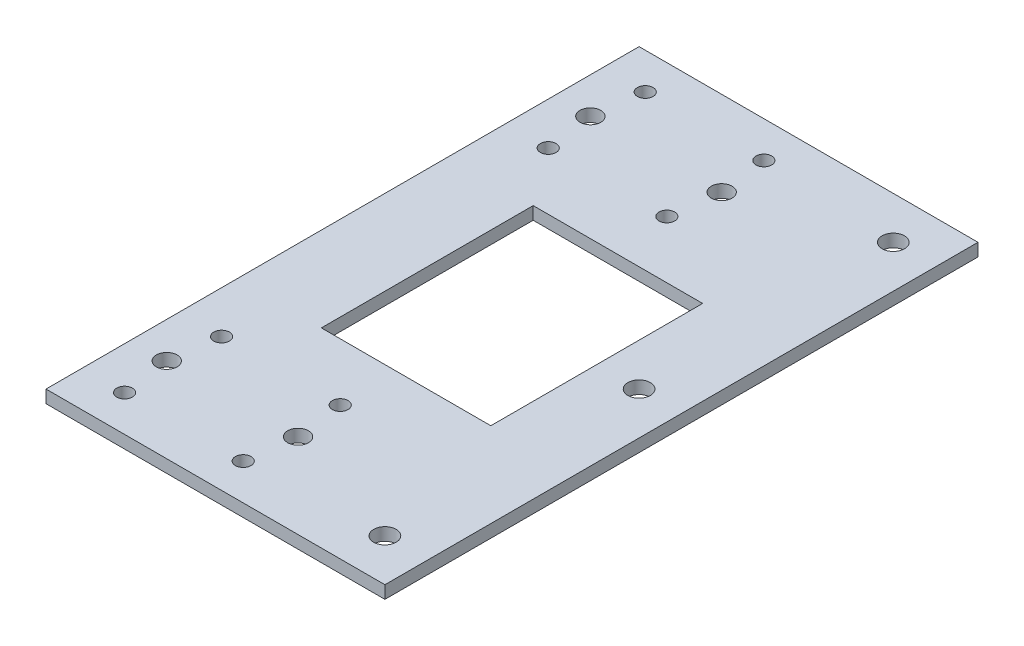
ISO-10303-21;
HEADER;
FILE_DESCRIPTION(('STEP AP214'),'2;1');
FILE_NAME('part.step','',(''),(''),'','','');
FILE_SCHEMA(('AUTOMOTIVE_DESIGN { 1 0 10303 214 1 1 1 1 }'));
ENDSEC;
DATA;
#1=APPLICATION_CONTEXT('core data for automotive mechanical design processes');
#2=APPLICATION_PROTOCOL_DEFINITION('international standard','automotive_design',2000,#1);
#3=PRODUCT_CONTEXT('',#1,'mechanical');
#4=PRODUCT('Part','Part','',(#3));
#5=PRODUCT_RELATED_PRODUCT_CATEGORY('part','',(#4));
#6=PRODUCT_DEFINITION_FORMATION('','',#4);
#7=PRODUCT_DEFINITION_CONTEXT('part definition',#1,'design');
#8=PRODUCT_DEFINITION('design','',#6,#7);
#9=PRODUCT_DEFINITION_SHAPE('','',#8);
#10=(LENGTH_UNIT() NAMED_UNIT(*) SI_UNIT(.MILLI.,.METRE.));
#11=(NAMED_UNIT(*) PLANE_ANGLE_UNIT() SI_UNIT($,.RADIAN.));
#12=(NAMED_UNIT(*) SI_UNIT($,.STERADIAN.) SOLID_ANGLE_UNIT());
#13=UNCERTAINTY_MEASURE_WITH_UNIT(LENGTH_MEASURE(1.E-05),#10,'distance_accuracy_value','');
#14=(GEOMETRIC_REPRESENTATION_CONTEXT(3) GLOBAL_UNCERTAINTY_ASSIGNED_CONTEXT((#13)) GLOBAL_UNIT_ASSIGNED_CONTEXT((#10,
#11,#12)) REPRESENTATION_CONTEXT('',''));
#15=CARTESIAN_POINT('',(0.,0.,0.));
#16=DIRECTION('',(0.,0.,1.));
#17=DIRECTION('',(1.,0.,0.));
#18=AXIS2_PLACEMENT_3D('',#15,#16,#17);
#19=CARTESIAN_POINT('',(40.,3.,0.));
#20=DIRECTION('',(-1.,0.,0.));
#21=DIRECTION('',(0.,0.,1.));
#22=AXIS2_PLACEMENT_3D('',#19,#20,#21);
#23=PLANE('',#22);
#24=DIRECTION('',(0.,0.,-1.));
#25=VECTOR('',#24,1.);
#26=CARTESIAN_POINT('',(40.,0.,0.));
#27=LINE('',#26,#25);
#28=CARTESIAN_POINT('',(40.,0.,70.));
#29=VERTEX_POINT('',#28);
#30=CARTESIAN_POINT('',(40.,0.,-70.));
#31=VERTEX_POINT('',#30);
#32=EDGE_CURVE('E228',#29,#31,#27,.T.);
#33=ORIENTED_EDGE('',*,*,#32,.T.);
#34=DIRECTION('',(0.,-1.,0.));
#35=VECTOR('',#34,1.);
#36=CARTESIAN_POINT('',(40.,3.,-70.));
#37=LINE('',#36,#35);
#38=CARTESIAN_POINT('',(40.,3.,-70.));
#39=VERTEX_POINT('',#38);
#40=EDGE_CURVE('E11',#39,#31,#37,.T.);
#41=ORIENTED_EDGE('',*,*,#40,.F.);
#42=DIRECTION('',(0.,0.,-1.));
#43=VECTOR('',#42,1.);
#44=CARTESIAN_POINT('',(40.,3.,0.));
#45=LINE('',#44,#43);
#46=CARTESIAN_POINT('',(40.,3.,70.));
#47=VERTEX_POINT('',#46);
#48=EDGE_CURVE('E165',#47,#39,#45,.T.);
#49=ORIENTED_EDGE('',*,*,#48,.F.);
#50=DIRECTION('',(0.,-1.,0.));
#51=VECTOR('',#50,1.);
#52=CARTESIAN_POINT('',(40.,3.,70.));
#53=LINE('',#52,#51);
#54=EDGE_CURVE('E224',#47,#29,#53,.T.);
#55=ORIENTED_EDGE('',*,*,#54,.T.);
#56=EDGE_LOOP('',(#33,#41,#49,#55));
#57=FACE_BOUND('',#56,.T.);
#58=ADVANCED_FACE('F46',(#57),#23,.F.);
#59=CARTESIAN_POINT('',(0.,3.,-70.));
#60=DIRECTION('',(0.,0.,-1.));
#61=DIRECTION('',(-1.,0.,0.));
#62=AXIS2_PLACEMENT_3D('',#59,#60,#61);
#63=PLANE('',#62);
#64=DIRECTION('',(1.,0.,0.));
#65=VECTOR('',#64,1.);
#66=CARTESIAN_POINT('',(0.,0.,-70.));
#67=LINE('',#66,#65);
#68=CARTESIAN_POINT('',(-40.,0.,-70.));
#69=VERTEX_POINT('',#68);
#70=EDGE_CURVE('E232',#69,#31,#67,.T.);
#71=ORIENTED_EDGE('',*,*,#70,.F.);
#72=DIRECTION('',(0.,-1.,0.));
#73=VECTOR('',#72,1.);
#74=CARTESIAN_POINT('',(-40.,3.,-70.));
#75=LINE('',#74,#73);
#76=CARTESIAN_POINT('',(-40.,3.,-70.));
#77=VERTEX_POINT('',#76);
#78=EDGE_CURVE('E56',#77,#69,#75,.T.);
#79=ORIENTED_EDGE('',*,*,#78,.F.);
#80=DIRECTION('',(1.,0.,0.));
#81=VECTOR('',#80,1.);
#82=CARTESIAN_POINT('',(0.,3.,-70.));
#83=LINE('',#82,#81);
#84=EDGE_CURVE('E169',#77,#39,#83,.T.);
#85=ORIENTED_EDGE('',*,*,#84,.T.);
#86=ORIENTED_EDGE('',*,*,#40,.T.);
#87=EDGE_LOOP('',(#71,#79,#85,#86));
#88=FACE_BOUND('',#87,.T.);
#89=ADVANCED_FACE('F377',(#88),#63,.T.);
#90=CARTESIAN_POINT('',(-40.,3.,0.));
#91=DIRECTION('',(-1.,0.,0.));
#92=DIRECTION('',(0.,0.,1.));
#93=AXIS2_PLACEMENT_3D('',#90,#91,#92);
#94=PLANE('',#93);
#95=DIRECTION('',(0.,0.,-1.));
#96=VECTOR('',#95,1.);
#97=CARTESIAN_POINT('',(-40.,0.,0.));
#98=LINE('',#97,#96);
#99=CARTESIAN_POINT('',(-40.,0.,70.));
#100=VERTEX_POINT('',#99);
#101=EDGE_CURVE('E236',#100,#69,#98,.T.);
#102=ORIENTED_EDGE('',*,*,#101,.F.);
#103=DIRECTION('',(0.,-1.,0.));
#104=VECTOR('',#103,1.);
#105=CARTESIAN_POINT('',(-40.,3.,70.));
#106=LINE('',#105,#104);
#107=CARTESIAN_POINT('',(-40.,3.,70.));
#108=VERTEX_POINT('',#107);
#109=EDGE_CURVE('E289',#108,#100,#106,.T.);
#110=ORIENTED_EDGE('',*,*,#109,.F.);
#111=DIRECTION('',(0.,0.,-1.));
#112=VECTOR('',#111,1.);
#113=CARTESIAN_POINT('',(-40.,3.,0.));
#114=LINE('',#113,#112);
#115=EDGE_CURVE('E173',#108,#77,#114,.T.);
#116=ORIENTED_EDGE('',*,*,#115,.T.);
#117=ORIENTED_EDGE('',*,*,#78,.T.);
#118=EDGE_LOOP('',(#102,#110,#116,#117));
#119=FACE_BOUND('',#118,.T.);
#120=ADVANCED_FACE('F382',(#119),#94,.T.);
#121=CARTESIAN_POINT('',(-0.499999999999992,3.,-50.));
#122=DIRECTION('',(0.,-1.,0.));
#123=DIRECTION('',(0.,0.,-1.));
#124=AXIS2_PLACEMENT_3D('',#121,#122,#123);
#125=CYLINDRICAL_SURFACE('',#124,2.45);
#126=CARTESIAN_POINT('',(-0.499999999999992,3.,-50.));
#127=DIRECTION('',(0.,1.,0.));
#128=DIRECTION('',(0.,0.,1.));
#129=AXIS2_PLACEMENT_3D('',#126,#127,#128);
#130=CIRCLE('',#129,2.45);
#131=CARTESIAN_POINT('',(-0.499999999999992,3.,-47.55));
#132=VERTEX_POINT('',#131);
#133=EDGE_CURVE('E216',#132,#132,#130,.T.);
#134=ORIENTED_EDGE('',*,*,#133,.T.);
#135=EDGE_LOOP('',(#134));
#136=FACE_BOUND('',#135,.T.);
#137=CARTESIAN_POINT('',(-0.499999999999992,0.,-50.));
#138=DIRECTION('',(0.,1.,0.));
#139=DIRECTION('',(0.,0.,1.));
#140=AXIS2_PLACEMENT_3D('',#137,#138,#139);
#141=CIRCLE('',#140,2.45);
#142=CARTESIAN_POINT('',(-0.499999999999992,0.,-47.55));
#143=VERTEX_POINT('',#142);
#144=EDGE_CURVE('E279',#143,#143,#141,.T.);
#145=ORIENTED_EDGE('',*,*,#144,.F.);
#146=EDGE_LOOP('',(#145));
#147=FACE_BOUND('',#146,.T.);
#148=ADVANCED_FACE('F388',(#136,#147),#125,.F.);
#149=CARTESIAN_POINT('',(-2.00000000000001,3.,-61.45));
#150=DIRECTION('',(0.,-1.,0.));
#151=DIRECTION('',(0.,0.,-1.));
#152=AXIS2_PLACEMENT_3D('',#149,#150,#151);
#153=CYLINDRICAL_SURFACE('',#152,1.85);
#154=CARTESIAN_POINT('',(-2.00000000000001,3.,-61.45));
#155=DIRECTION('',(0.,1.,0.));
#156=DIRECTION('',(0.,0.,1.));
#157=AXIS2_PLACEMENT_3D('',#154,#155,#156);
#158=CIRCLE('',#157,1.85);
#159=CARTESIAN_POINT('',(-2.00000000000001,3.,-59.6));
#160=VERTEX_POINT('',#159);
#161=EDGE_CURVE('E212',#160,#160,#158,.F.);
#162=ORIENTED_EDGE('',*,*,#161,.F.);
#163=EDGE_LOOP('',(#162));
#164=FACE_BOUND('',#163,.T.);
#165=CARTESIAN_POINT('',(-2.00000000000001,0.,-61.45));
#166=DIRECTION('',(0.,1.,0.));
#167=DIRECTION('',(0.,0.,1.));
#168=AXIS2_PLACEMENT_3D('',#165,#166,#167);
#169=CIRCLE('',#168,1.85);
#170=CARTESIAN_POINT('',(-2.00000000000001,0.,-59.6));
#171=VERTEX_POINT('',#170);
#172=EDGE_CURVE('E275',#171,#171,#169,.F.);
#173=ORIENTED_EDGE('',*,*,#172,.T.);
#174=EDGE_LOOP('',(#173));
#175=FACE_BOUND('',#174,.T.);
#176=ADVANCED_FACE('F425',(#164,#175),#153,.F.);
#177=CARTESIAN_POINT('',(-2.00000000000001,3.,-38.55));
#178=DIRECTION('',(0.,-1.,0.));
#179=DIRECTION('',(0.,0.,-1.));
#180=AXIS2_PLACEMENT_3D('',#177,#178,#179);
#181=CYLINDRICAL_SURFACE('',#180,1.85);
#182=CARTESIAN_POINT('',(-2.00000000000001,3.,-38.55));
#183=DIRECTION('',(0.,1.,0.));
#184=DIRECTION('',(0.,0.,1.));
#185=AXIS2_PLACEMENT_3D('',#182,#183,#184);
#186=CIRCLE('',#185,1.85);
#187=CARTESIAN_POINT('',(-2.00000000000001,3.,-36.7));
#188=VERTEX_POINT('',#187);
#189=EDGE_CURVE('E208',#188,#188,#186,.T.);
#190=ORIENTED_EDGE('',*,*,#189,.T.);
#191=EDGE_LOOP('',(#190));
#192=FACE_BOUND('',#191,.T.);
#193=CARTESIAN_POINT('',(-2.00000000000001,0.,-38.55));
#194=DIRECTION('',(0.,1.,0.));
#195=DIRECTION('',(0.,0.,1.));
#196=AXIS2_PLACEMENT_3D('',#193,#194,#195);
#197=CIRCLE('',#196,1.85);
#198=CARTESIAN_POINT('',(-2.00000000000001,0.,-36.7));
#199=VERTEX_POINT('',#198);
#200=EDGE_CURVE('E271',#199,#199,#197,.T.);
#201=ORIENTED_EDGE('',*,*,#200,.F.);
#202=EDGE_LOOP('',(#201));
#203=FACE_BOUND('',#202,.T.);
#204=ADVANCED_FACE('F421',(#192,#203),#181,.F.);
#205=CARTESIAN_POINT('',(-30.,3.,-38.55));
#206=DIRECTION('',(0.,-1.,0.));
#207=DIRECTION('',(0.,0.,-1.));
#208=AXIS2_PLACEMENT_3D('',#205,#206,#207);
#209=CYLINDRICAL_SURFACE('',#208,1.85);
#210=CARTESIAN_POINT('',(-30.,3.,-38.55));
#211=DIRECTION('',(0.,1.,0.));
#212=DIRECTION('',(0.,0.,1.));
#213=AXIS2_PLACEMENT_3D('',#210,#211,#212);
#214=CIRCLE('',#213,1.85);
#215=CARTESIAN_POINT('',(-30.,3.,-36.7));
#216=VERTEX_POINT('',#215);
#217=EDGE_CURVE('E204',#216,#216,#214,.F.);
#218=ORIENTED_EDGE('',*,*,#217,.F.);
#219=EDGE_LOOP('',(#218));
#220=FACE_BOUND('',#219,.T.);
#221=CARTESIAN_POINT('',(-30.,0.,-38.55));
#222=DIRECTION('',(0.,1.,0.));
#223=DIRECTION('',(0.,0.,1.));
#224=AXIS2_PLACEMENT_3D('',#221,#222,#223);
#225=CIRCLE('',#224,1.85);
#226=CARTESIAN_POINT('',(-30.,0.,-36.7));
#227=VERTEX_POINT('',#226);
#228=EDGE_CURVE('E267',#227,#227,#225,.F.);
#229=ORIENTED_EDGE('',*,*,#228,.T.);
#230=EDGE_LOOP('',(#229));
#231=FACE_BOUND('',#230,.T.);
#232=ADVANCED_FACE('F417',(#220,#231),#209,.F.);
#233=CARTESIAN_POINT('',(-30.,3.,61.4500000000001));
#234=DIRECTION('',(0.,-1.,0.));
#235=DIRECTION('',(0.,0.,-1.));
#236=AXIS2_PLACEMENT_3D('',#233,#234,#235);
#237=CYLINDRICAL_SURFACE('',#236,1.85);
#238=CARTESIAN_POINT('',(-30.,3.,61.4500000000001));
#239=DIRECTION('',(0.,1.,0.));
#240=DIRECTION('',(0.,0.,1.));
#241=AXIS2_PLACEMENT_3D('',#238,#239,#240);
#242=CIRCLE('',#241,1.85);
#243=CARTESIAN_POINT('',(-30.,3.,63.3000000000001));
#244=VERTEX_POINT('',#243);
#245=EDGE_CURVE('E200',#244,#244,#242,.F.);
#246=ORIENTED_EDGE('',*,*,#245,.F.);
#247=EDGE_LOOP('',(#246));
#248=FACE_BOUND('',#247,.T.);
#249=CARTESIAN_POINT('',(-30.,0.,61.4500000000001));
#250=DIRECTION('',(0.,1.,0.));
#251=DIRECTION('',(0.,0.,1.));
#252=AXIS2_PLACEMENT_3D('',#249,#250,#251);
#253=CIRCLE('',#252,1.85);
#254=CARTESIAN_POINT('',(-30.,0.,63.3000000000001));
#255=VERTEX_POINT('',#254);
#256=EDGE_CURVE('E263',#255,#255,#253,.F.);
#257=ORIENTED_EDGE('',*,*,#256,.T.);
#258=EDGE_LOOP('',(#257));
#259=FACE_BOUND('',#258,.T.);
#260=ADVANCED_FACE('F413',(#248,#259),#237,.F.);
#261=CARTESIAN_POINT('',(-31.5,3.,50.));
#262=DIRECTION('',(0.,-1.,0.));
#263=DIRECTION('',(0.,0.,-1.));
#264=AXIS2_PLACEMENT_3D('',#261,#262,#263);
#265=CYLINDRICAL_SURFACE('',#264,2.45);
#266=CARTESIAN_POINT('',(-31.5,3.,50.));
#267=DIRECTION('',(0.,1.,0.));
#268=DIRECTION('',(0.,0.,1.));
#269=AXIS2_PLACEMENT_3D('',#266,#267,#268);
#270=CIRCLE('',#269,2.45);
#271=CARTESIAN_POINT('',(-31.5,3.,52.4500000000001));
#272=VERTEX_POINT('',#271);
#273=EDGE_CURVE('E196',#272,#272,#270,.T.);
#274=ORIENTED_EDGE('',*,*,#273,.T.);
#275=EDGE_LOOP('',(#274));
#276=FACE_BOUND('',#275,.T.);
#277=CARTESIAN_POINT('',(-31.5,0.,50.));
#278=DIRECTION('',(0.,1.,0.));
#279=DIRECTION('',(0.,0.,1.));
#280=AXIS2_PLACEMENT_3D('',#277,#278,#279);
#281=CIRCLE('',#280,2.45);
#282=CARTESIAN_POINT('',(-31.5,0.,52.4500000000001));
#283=VERTEX_POINT('',#282);
#284=EDGE_CURVE('E259',#283,#283,#281,.T.);
#285=ORIENTED_EDGE('',*,*,#284,.F.);
#286=EDGE_LOOP('',(#285));
#287=FACE_BOUND('',#286,.T.);
#288=ADVANCED_FACE('F409',(#276,#287),#265,.F.);
#289=CARTESIAN_POINT('',(-30.,3.,38.55));
#290=DIRECTION('',(0.,-1.,0.));
#291=DIRECTION('',(0.,0.,-1.));
#292=AXIS2_PLACEMENT_3D('',#289,#290,#291);
#293=CYLINDRICAL_SURFACE('',#292,1.85);
#294=CARTESIAN_POINT('',(-30.,3.,38.55));
#295=DIRECTION('',(0.,1.,0.));
#296=DIRECTION('',(0.,0.,1.));
#297=AXIS2_PLACEMENT_3D('',#294,#295,#296);
#298=CIRCLE('',#297,1.85);
#299=CARTESIAN_POINT('',(-30.,3.,40.4));
#300=VERTEX_POINT('',#299);
#301=EDGE_CURVE('E192',#300,#300,#298,.T.);
#302=ORIENTED_EDGE('',*,*,#301,.T.);
#303=EDGE_LOOP('',(#302));
#304=FACE_BOUND('',#303,.T.);
#305=CARTESIAN_POINT('',(-30.,0.,38.55));
#306=DIRECTION('',(0.,1.,0.));
#307=DIRECTION('',(0.,0.,1.));
#308=AXIS2_PLACEMENT_3D('',#305,#306,#307);
#309=CIRCLE('',#308,1.85);
#310=CARTESIAN_POINT('',(-30.,0.,40.4));
#311=VERTEX_POINT('',#310);
#312=EDGE_CURVE('E255',#311,#311,#309,.T.);
#313=ORIENTED_EDGE('',*,*,#312,.F.);
#314=EDGE_LOOP('',(#313));
#315=FACE_BOUND('',#314,.T.);
#316=ADVANCED_FACE('F405',(#304,#315),#293,.F.);
#317=CARTESIAN_POINT('',(-2.00000000000001,3.,61.4500000000001));
#318=DIRECTION('',(0.,-1.,0.));
#319=DIRECTION('',(0.,0.,-1.));
#320=AXIS2_PLACEMENT_3D('',#317,#318,#319);
#321=CYLINDRICAL_SURFACE('',#320,1.85);
#322=CARTESIAN_POINT('',(-2.00000000000001,3.,61.4500000000001));
#323=DIRECTION('',(0.,1.,0.));
#324=DIRECTION('',(0.,0.,1.));
#325=AXIS2_PLACEMENT_3D('',#322,#323,#324);
#326=CIRCLE('',#325,1.85);
#327=CARTESIAN_POINT('',(-2.00000000000001,3.,63.3000000000001));
#328=VERTEX_POINT('',#327);
#329=EDGE_CURVE('E188',#328,#328,#326,.T.);
#330=ORIENTED_EDGE('',*,*,#329,.T.);
#331=EDGE_LOOP('',(#330));
#332=FACE_BOUND('',#331,.T.);
#333=CARTESIAN_POINT('',(-2.00000000000001,0.,61.4500000000001));
#334=DIRECTION('',(0.,1.,0.));
#335=DIRECTION('',(0.,0.,1.));
#336=AXIS2_PLACEMENT_3D('',#333,#334,#335);
#337=CIRCLE('',#336,1.85);
#338=CARTESIAN_POINT('',(-2.00000000000001,0.,63.3000000000001));
#339=VERTEX_POINT('',#338);
#340=EDGE_CURVE('E251',#339,#339,#337,.T.);
#341=ORIENTED_EDGE('',*,*,#340,.F.);
#342=EDGE_LOOP('',(#341));
#343=FACE_BOUND('',#342,.T.);
#344=ADVANCED_FACE('F401',(#332,#343),#321,.F.);
#345=CARTESIAN_POINT('',(-2.00000000000001,3.,38.55));
#346=DIRECTION('',(0.,-1.,0.));
#347=DIRECTION('',(0.,0.,-1.));
#348=AXIS2_PLACEMENT_3D('',#345,#346,#347);
#349=CYLINDRICAL_SURFACE('',#348,1.85);
#350=CARTESIAN_POINT('',(-2.00000000000001,3.,38.55));
#351=DIRECTION('',(0.,1.,0.));
#352=DIRECTION('',(0.,0.,1.));
#353=AXIS2_PLACEMENT_3D('',#350,#351,#352);
#354=CIRCLE('',#353,1.85);
#355=CARTESIAN_POINT('',(-2.00000000000001,3.,40.4));
#356=VERTEX_POINT('',#355);
#357=EDGE_CURVE('E184',#356,#356,#354,.F.);
#358=ORIENTED_EDGE('',*,*,#357,.F.);
#359=EDGE_LOOP('',(#358));
#360=FACE_BOUND('',#359,.T.);
#361=CARTESIAN_POINT('',(-2.00000000000001,0.,38.55));
#362=DIRECTION('',(0.,1.,0.));
#363=DIRECTION('',(0.,0.,1.));
#364=AXIS2_PLACEMENT_3D('',#361,#362,#363);
#365=CIRCLE('',#364,1.85);
#366=CARTESIAN_POINT('',(-2.00000000000001,0.,40.4));
#367=VERTEX_POINT('',#366);
#368=EDGE_CURVE('E247',#367,#367,#365,.F.);
#369=ORIENTED_EDGE('',*,*,#368,.T.);
#370=EDGE_LOOP('',(#369));
#371=FACE_BOUND('',#370,.T.);
#372=ADVANCED_FACE('F397',(#360,#371),#349,.F.);
#373=CARTESIAN_POINT('',(-0.499999999999992,3.,50.));
#374=DIRECTION('',(0.,-1.,0.));
#375=DIRECTION('',(0.,0.,-1.));
#376=AXIS2_PLACEMENT_3D('',#373,#374,#375);
#377=CYLINDRICAL_SURFACE('',#376,2.45);
#378=CARTESIAN_POINT('',(-0.499999999999992,3.,50.));
#379=DIRECTION('',(0.,1.,0.));
#380=DIRECTION('',(0.,0.,1.));
#381=AXIS2_PLACEMENT_3D('',#378,#379,#380);
#382=CIRCLE('',#381,2.45);
#383=CARTESIAN_POINT('',(-0.499999999999992,3.,52.4500000000001));
#384=VERTEX_POINT('',#383);
#385=EDGE_CURVE('E180',#384,#384,#382,.F.);
#386=ORIENTED_EDGE('',*,*,#385,.F.);
#387=EDGE_LOOP('',(#386));
#388=FACE_BOUND('',#387,.T.);
#389=CARTESIAN_POINT('',(-0.499999999999992,0.,50.));
#390=DIRECTION('',(0.,1.,0.));
#391=DIRECTION('',(0.,0.,1.));
#392=AXIS2_PLACEMENT_3D('',#389,#390,#391);
#393=CIRCLE('',#392,2.45);
#394=CARTESIAN_POINT('',(-0.499999999999992,0.,52.4500000000001));
#395=VERTEX_POINT('',#394);
#396=EDGE_CURVE('E243',#395,#395,#393,.F.);
#397=ORIENTED_EDGE('',*,*,#396,.T.);
#398=EDGE_LOOP('',(#397));
#399=FACE_BOUND('',#398,.T.);
#400=ADVANCED_FACE('F393',(#388,#399),#377,.F.);
#401=CARTESIAN_POINT('',(0.,3.,70.));
#402=DIRECTION('',(0.,0.,-1.));
#403=DIRECTION('',(-1.,0.,0.));
#404=AXIS2_PLACEMENT_3D('',#401,#402,#403);
#405=PLANE('',#404);
#406=DIRECTION('',(1.,0.,0.));
#407=VECTOR('',#406,1.);
#408=CARTESIAN_POINT('',(0.,0.,70.));
#409=LINE('',#408,#407);
#410=EDGE_CURVE('E240',#100,#29,#409,.T.);
#411=ORIENTED_EDGE('',*,*,#410,.T.);
#412=ORIENTED_EDGE('',*,*,#54,.F.);
#413=DIRECTION('',(1.,0.,0.));
#414=VECTOR('',#413,1.);
#415=CARTESIAN_POINT('',(0.,3.,70.));
#416=LINE('',#415,#414);
#417=EDGE_CURVE('E177',#108,#47,#416,.T.);
#418=ORIENTED_EDGE('',*,*,#417,.F.);
#419=ORIENTED_EDGE('',*,*,#109,.T.);
#420=EDGE_LOOP('',(#411,#412,#418,#419));
#421=FACE_BOUND('',#420,.T.);
#422=ADVANCED_FACE('F390',(#421),#405,.F.);
#423=CARTESIAN_POINT('',(-30.,3.,-61.45));
#424=DIRECTION('',(0.,-1.,0.));
#425=DIRECTION('',(0.,0.,-1.));
#426=AXIS2_PLACEMENT_3D('',#423,#424,#425);
#427=CYLINDRICAL_SURFACE('',#426,1.85);
#428=CARTESIAN_POINT('',(-30.,3.,-61.45));
#429=DIRECTION('',(0.,1.,0.));
#430=DIRECTION('',(0.,0.,1.));
#431=AXIS2_PLACEMENT_3D('',#428,#429,#430);
#432=CIRCLE('',#431,1.85);
#433=CARTESIAN_POINT('',(-30.,3.,-59.6));
#434=VERTEX_POINT('',#433);
#435=EDGE_CURVE('E161',#434,#434,#432,.T.);
#436=ORIENTED_EDGE('',*,*,#435,.T.);
#437=EDGE_LOOP('',(#436));
#438=FACE_BOUND('',#437,.T.);
#439=CARTESIAN_POINT('',(-30.,0.,-61.45));
#440=DIRECTION('',(0.,1.,0.));
#441=DIRECTION('',(0.,0.,1.));
#442=AXIS2_PLACEMENT_3D('',#439,#440,#441);
#443=CIRCLE('',#442,1.85);
#444=CARTESIAN_POINT('',(-30.,0.,-59.6));
#445=VERTEX_POINT('',#444);
#446=EDGE_CURVE('E129',#445,#445,#443,.T.);
#447=ORIENTED_EDGE('',*,*,#446,.F.);
#448=EDGE_LOOP('',(#447));
#449=FACE_BOUND('',#448,.T.);
#450=ADVANCED_FACE('F48',(#438,#449),#427,.F.);
#451=CARTESIAN_POINT('',(-31.5,3.,-50.));
#452=DIRECTION('',(0.,-1.,0.));
#453=DIRECTION('',(0.,0.,-1.));
#454=AXIS2_PLACEMENT_3D('',#451,#452,#453);
#455=CYLINDRICAL_SURFACE('',#454,2.45);
#456=CARTESIAN_POINT('',(-31.5,3.,-50.));
#457=DIRECTION('',(0.,1.,0.));
#458=DIRECTION('',(0.,0.,1.));
#459=AXIS2_PLACEMENT_3D('',#456,#457,#458);
#460=CIRCLE('',#459,2.45);
#461=CARTESIAN_POINT('',(-31.5,3.,-47.55));
#462=VERTEX_POINT('',#461);
#463=EDGE_CURVE('E220',#462,#462,#460,.F.);
#464=ORIENTED_EDGE('',*,*,#463,.F.);
#465=EDGE_LOOP('',(#464));
#466=FACE_BOUND('',#465,.T.);
#467=CARTESIAN_POINT('',(-31.5,0.,-50.));
#468=DIRECTION('',(0.,1.,0.));
#469=DIRECTION('',(0.,0.,1.));
#470=AXIS2_PLACEMENT_3D('',#467,#468,#469);
#471=CIRCLE('',#470,2.45);
#472=CARTESIAN_POINT('',(-31.5,0.,-47.55));
#473=VERTEX_POINT('',#472);
#474=EDGE_CURVE('E166',#473,#473,#471,.F.);
#475=ORIENTED_EDGE('',*,*,#474,.T.);
#476=EDGE_LOOP('',(#475));
#477=FACE_BOUND('',#476,.T.);
#478=ADVANCED_FACE('F327',(#466,#477),#455,.F.);
#479=CARTESIAN_POINT('',(0.,3.,0.));
#480=DIRECTION('',(0.,1.,0.));
#481=DIRECTION('',(0.,0.,1.));
#482=AXIS2_PLACEMENT_3D('',#479,#480,#481);
#483=PLANE('',#482);
#484=CARTESIAN_POINT('',(30.,3.,-60.));
#485=DIRECTION('',(0.,1.,0.));
#486=DIRECTION('',(0.,0.,1.));
#487=AXIS2_PLACEMENT_3D('',#484,#485,#486);
#488=CIRCLE('',#487,2.65);
#489=CARTESIAN_POINT('',(30.,3.,-57.35));
#490=VERTEX_POINT('',#489);
#491=EDGE_CURVE('E298',#490,#490,#488,.T.);
#492=ORIENTED_EDGE('',*,*,#491,.F.);
#493=EDGE_LOOP('',(#492));
#494=FACE_BOUND('',#493,.T.);
#495=CARTESIAN_POINT('',(30.0000000000006,3.,0.));
#496=DIRECTION('',(0.,1.,0.));
#497=DIRECTION('',(0.,0.,1.));
#498=AXIS2_PLACEMENT_3D('',#495,#496,#497);
#499=CIRCLE('',#498,2.65);
#500=CARTESIAN_POINT('',(30.0000000000006,3.,2.64999999999999));
#501=VERTEX_POINT('',#500);
#502=EDGE_CURVE('E313',#501,#501,#499,.T.);
#503=ORIENTED_EDGE('',*,*,#502,.F.);
#504=EDGE_LOOP('',(#503));
#505=FACE_BOUND('',#504,.T.);
#506=CARTESIAN_POINT('',(30.0000000000012,3.,60.));
#507=DIRECTION('',(0.,1.,0.));
#508=DIRECTION('',(0.,0.,1.));
#509=AXIS2_PLACEMENT_3D('',#506,#507,#508);
#510=CIRCLE('',#509,2.65);
#511=CARTESIAN_POINT('',(30.0000000000012,3.,62.65));
#512=VERTEX_POINT('',#511);
#513=EDGE_CURVE('E309',#512,#512,#510,.T.);
#514=ORIENTED_EDGE('',*,*,#513,.F.);
#515=EDGE_LOOP('',(#514));
#516=FACE_BOUND('',#515,.T.);
#517=DIRECTION('',(0.,0.,1.));
#518=VECTOR('',#517,1.);
#519=CARTESIAN_POINT('',(-20.,3.,25.));
#520=LINE('',#519,#518);
#521=CARTESIAN_POINT('',(-20.,3.,-25.));
#522=VERTEX_POINT('',#521);
#523=CARTESIAN_POINT('',(-20.,3.,25.));
#524=VERTEX_POINT('',#523);
#525=EDGE_CURVE('E64',#522,#524,#520,.T.);
#526=ORIENTED_EDGE('',*,*,#525,.F.);
#527=DIRECTION('',(-1.,0.,0.));
#528=VECTOR('',#527,1.);
#529=CARTESIAN_POINT('',(20.,3.,-25.));
#530=LINE('',#529,#528);
#531=CARTESIAN_POINT('',(20.,3.,-25.));
#532=VERTEX_POINT('',#531);
#533=EDGE_CURVE('E122',#532,#522,#530,.T.);
#534=ORIENTED_EDGE('',*,*,#533,.F.);
#535=DIRECTION('',(0.,0.,-1.));
#536=VECTOR('',#535,1.);
#537=CARTESIAN_POINT('',(20.,3.,25.));
#538=LINE('',#537,#536);
#539=CARTESIAN_POINT('',(20.,3.,25.));
#540=VERTEX_POINT('',#539);
#541=EDGE_CURVE('E147',#540,#532,#538,.T.);
#542=ORIENTED_EDGE('',*,*,#541,.F.);
#543=DIRECTION('',(1.,0.,0.));
#544=VECTOR('',#543,1.);
#545=CARTESIAN_POINT('',(20.,3.,25.));
#546=LINE('',#545,#544);
#547=EDGE_CURVE('E140',#524,#540,#546,.T.);
#548=ORIENTED_EDGE('',*,*,#547,.F.);
#549=EDGE_LOOP('',(#526,#534,#542,#548));
#550=FACE_BOUND('',#549,.T.);
#551=ORIENTED_EDGE('',*,*,#435,.F.);
#552=EDGE_LOOP('',(#551));
#553=FACE_BOUND('',#552,.T.);
#554=ORIENTED_EDGE('',*,*,#48,.T.);
#555=ORIENTED_EDGE('',*,*,#84,.F.);
#556=ORIENTED_EDGE('',*,*,#115,.F.);
#557=ORIENTED_EDGE('',*,*,#417,.T.);
#558=EDGE_LOOP('',(#554,#555,#556,#557));
#559=FACE_BOUND('',#558,.T.);
#560=ORIENTED_EDGE('',*,*,#385,.T.);
#561=EDGE_LOOP('',(#560));
#562=FACE_BOUND('',#561,.T.);
#563=ORIENTED_EDGE('',*,*,#357,.T.);
#564=EDGE_LOOP('',(#563));
#565=FACE_BOUND('',#564,.T.);
#566=ORIENTED_EDGE('',*,*,#329,.F.);
#567=EDGE_LOOP('',(#566));
#568=FACE_BOUND('',#567,.T.);
#569=ORIENTED_EDGE('',*,*,#301,.F.);
#570=EDGE_LOOP('',(#569));
#571=FACE_BOUND('',#570,.T.);
#572=ORIENTED_EDGE('',*,*,#273,.F.);
#573=EDGE_LOOP('',(#572));
#574=FACE_BOUND('',#573,.T.);
#575=ORIENTED_EDGE('',*,*,#245,.T.);
#576=EDGE_LOOP('',(#575));
#577=FACE_BOUND('',#576,.T.);
#578=ORIENTED_EDGE('',*,*,#217,.T.);
#579=EDGE_LOOP('',(#578));
#580=FACE_BOUND('',#579,.T.);
#581=ORIENTED_EDGE('',*,*,#189,.F.);
#582=EDGE_LOOP('',(#581));
#583=FACE_BOUND('',#582,.T.);
#584=ORIENTED_EDGE('',*,*,#161,.T.);
#585=EDGE_LOOP('',(#584));
#586=FACE_BOUND('',#585,.T.);
#587=ORIENTED_EDGE('',*,*,#133,.F.);
#588=EDGE_LOOP('',(#587));
#589=FACE_BOUND('',#588,.T.);
#590=ORIENTED_EDGE('',*,*,#463,.T.);
#591=EDGE_LOOP('',(#590));
#592=FACE_BOUND('',#591,.T.);
#593=ADVANCED_FACE('F324',(#494,#505,#516,#550,#553,#559,#562,#565,#568,#571,#574,#577,#580,
#583,#586,#589,#592),#483,.T.);
#594=CARTESIAN_POINT('',(0.,0.,0.));
#595=DIRECTION('',(0.,1.,0.));
#596=DIRECTION('',(0.,0.,1.));
#597=AXIS2_PLACEMENT_3D('',#594,#595,#596);
#598=PLANE('',#597);
#599=CARTESIAN_POINT('',(30.,0.,-60.));
#600=DIRECTION('',(0.,1.,0.));
#601=DIRECTION('',(0.,0.,1.));
#602=AXIS2_PLACEMENT_3D('',#599,#600,#601);
#603=CIRCLE('',#602,2.65);
#604=CARTESIAN_POINT('',(30.,0.,-57.35));
#605=VERTEX_POINT('',#604);
#606=EDGE_CURVE('E50',#605,#605,#603,.T.);
#607=ORIENTED_EDGE('',*,*,#606,.T.);
#608=EDGE_LOOP('',(#607));
#609=FACE_BOUND('',#608,.T.);
#610=CARTESIAN_POINT('',(30.0000000000006,0.,0.));
#611=DIRECTION('',(0.,1.,0.));
#612=DIRECTION('',(0.,0.,1.));
#613=AXIS2_PLACEMENT_3D('',#610,#611,#612);
#614=CIRCLE('',#613,2.65);
#615=CARTESIAN_POINT('',(30.0000000000006,0.,2.64999999999999));
#616=VERTEX_POINT('',#615);
#617=EDGE_CURVE('E297',#616,#616,#614,.T.);
#618=ORIENTED_EDGE('',*,*,#617,.T.);
#619=EDGE_LOOP('',(#618));
#620=FACE_BOUND('',#619,.T.);
#621=CARTESIAN_POINT('',(30.0000000000012,0.,60.));
#622=DIRECTION('',(0.,1.,0.));
#623=DIRECTION('',(0.,0.,1.));
#624=AXIS2_PLACEMENT_3D('',#621,#622,#623);
#625=CIRCLE('',#624,2.65);
#626=CARTESIAN_POINT('',(30.0000000000012,0.,62.65));
#627=VERTEX_POINT('',#626);
#628=EDGE_CURVE('E294',#627,#627,#625,.T.);
#629=ORIENTED_EDGE('',*,*,#628,.T.);
#630=EDGE_LOOP('',(#629));
#631=FACE_BOUND('',#630,.T.);
#632=DIRECTION('',(1.,0.,0.));
#633=VECTOR('',#632,1.);
#634=CARTESIAN_POINT('',(20.,0.,-25.));
#635=LINE('',#634,#633);
#636=CARTESIAN_POINT('',(-20.,0.,-25.));
#637=VERTEX_POINT('',#636);
#638=CARTESIAN_POINT('',(20.,0.,-25.));
#639=VERTEX_POINT('',#638);
#640=EDGE_CURVE('E135',#637,#639,#635,.T.);
#641=ORIENTED_EDGE('',*,*,#640,.F.);
#642=DIRECTION('',(0.,0.,-1.));
#643=VECTOR('',#642,1.);
#644=CARTESIAN_POINT('',(-20.,0.,25.));
#645=LINE('',#644,#643);
#646=CARTESIAN_POINT('',(-20.,0.,25.));
#647=VERTEX_POINT('',#646);
#648=EDGE_CURVE('E115',#647,#637,#645,.T.);
#649=ORIENTED_EDGE('',*,*,#648,.F.);
#650=DIRECTION('',(-1.,0.,0.));
#651=VECTOR('',#650,1.);
#652=CARTESIAN_POINT('',(20.,0.,25.));
#653=LINE('',#652,#651);
#654=CARTESIAN_POINT('',(20.,0.,25.));
#655=VERTEX_POINT('',#654);
#656=EDGE_CURVE('E125',#655,#647,#653,.T.);
#657=ORIENTED_EDGE('',*,*,#656,.F.);
#658=DIRECTION('',(0.,0.,1.));
#659=VECTOR('',#658,1.);
#660=CARTESIAN_POINT('',(20.,0.,25.));
#661=LINE('',#660,#659);
#662=EDGE_CURVE('E72',#639,#655,#661,.T.);
#663=ORIENTED_EDGE('',*,*,#662,.F.);
#664=EDGE_LOOP('',(#641,#649,#657,#663));
#665=FACE_BOUND('',#664,.T.);
#666=ORIENTED_EDGE('',*,*,#446,.T.);
#667=EDGE_LOOP('',(#666));
#668=FACE_BOUND('',#667,.T.);
#669=ORIENTED_EDGE('',*,*,#32,.F.);
#670=ORIENTED_EDGE('',*,*,#410,.F.);
#671=ORIENTED_EDGE('',*,*,#101,.T.);
#672=ORIENTED_EDGE('',*,*,#70,.T.);
#673=EDGE_LOOP('',(#669,#670,#671,#672));
#674=FACE_BOUND('',#673,.T.);
#675=ORIENTED_EDGE('',*,*,#396,.F.);
#676=EDGE_LOOP('',(#675));
#677=FACE_BOUND('',#676,.T.);
#678=ORIENTED_EDGE('',*,*,#368,.F.);
#679=EDGE_LOOP('',(#678));
#680=FACE_BOUND('',#679,.T.);
#681=ORIENTED_EDGE('',*,*,#340,.T.);
#682=EDGE_LOOP('',(#681));
#683=FACE_BOUND('',#682,.T.);
#684=ORIENTED_EDGE('',*,*,#312,.T.);
#685=EDGE_LOOP('',(#684));
#686=FACE_BOUND('',#685,.T.);
#687=ORIENTED_EDGE('',*,*,#284,.T.);
#688=EDGE_LOOP('',(#687));
#689=FACE_BOUND('',#688,.T.);
#690=ORIENTED_EDGE('',*,*,#256,.F.);
#691=EDGE_LOOP('',(#690));
#692=FACE_BOUND('',#691,.T.);
#693=ORIENTED_EDGE('',*,*,#228,.F.);
#694=EDGE_LOOP('',(#693));
#695=FACE_BOUND('',#694,.T.);
#696=ORIENTED_EDGE('',*,*,#200,.T.);
#697=EDGE_LOOP('',(#696));
#698=FACE_BOUND('',#697,.T.);
#699=ORIENTED_EDGE('',*,*,#172,.F.);
#700=EDGE_LOOP('',(#699));
#701=FACE_BOUND('',#700,.T.);
#702=ORIENTED_EDGE('',*,*,#144,.T.);
#703=EDGE_LOOP('',(#702));
#704=FACE_BOUND('',#703,.T.);
#705=ORIENTED_EDGE('',*,*,#474,.F.);
#706=EDGE_LOOP('',(#705));
#707=FACE_BOUND('',#706,.T.);
#708=ADVANCED_FACE('F132',(#609,#620,#631,#665,#668,#674,#677,#680,#683,#686,#689,#692,#695,
#698,#701,#704,#707),#598,.F.);
#709=CARTESIAN_POINT('',(-20.,-0.00100000000000013,25.));
#710=DIRECTION('',(-1.,0.,0.));
#711=DIRECTION('',(0.,0.,1.));
#712=AXIS2_PLACEMENT_3D('',#709,#710,#711);
#713=PLANE('',#712);
#714=ORIENTED_EDGE('',*,*,#648,.T.);
#715=DIRECTION('',(0.,1.,0.));
#716=VECTOR('',#715,1.);
#717=CARTESIAN_POINT('',(-20.,-0.00100000000000013,-25.));
#718=LINE('',#717,#716);
#719=EDGE_CURVE('E130',#637,#522,#718,.T.);
#720=ORIENTED_EDGE('',*,*,#719,.T.);
#721=ORIENTED_EDGE('',*,*,#525,.T.);
#722=DIRECTION('',(0.,1.,0.));
#723=VECTOR('',#722,1.);
#724=CARTESIAN_POINT('',(-20.,-0.00100000000000013,25.));
#725=LINE('',#724,#723);
#726=EDGE_CURVE('E111',#647,#524,#725,.T.);
#727=ORIENTED_EDGE('',*,*,#726,.F.);
#728=EDGE_LOOP('',(#714,#720,#721,#727));
#729=FACE_BOUND('',#728,.T.);
#730=ADVANCED_FACE('F113',(#729),#713,.F.);
#731=CARTESIAN_POINT('',(20.,-0.00100000000000013,-25.));
#732=DIRECTION('',(0.,0.,-1.));
#733=DIRECTION('',(-1.,0.,0.));
#734=AXIS2_PLACEMENT_3D('',#731,#732,#733);
#735=PLANE('',#734);
#736=ORIENTED_EDGE('',*,*,#640,.T.);
#737=DIRECTION('',(0.,1.,0.));
#738=VECTOR('',#737,1.);
#739=CARTESIAN_POINT('',(20.,-0.00100000000000013,-25.));
#740=LINE('',#739,#738);
#741=EDGE_CURVE('E156',#639,#532,#740,.T.);
#742=ORIENTED_EDGE('',*,*,#741,.T.);
#743=ORIENTED_EDGE('',*,*,#533,.T.);
#744=ORIENTED_EDGE('',*,*,#719,.F.);
#745=EDGE_LOOP('',(#736,#742,#743,#744));
#746=FACE_BOUND('',#745,.T.);
#747=ADVANCED_FACE('F374',(#746),#735,.F.);
#748=CARTESIAN_POINT('',(20.,-0.00100000000000013,25.));
#749=DIRECTION('',(1.,0.,0.));
#750=DIRECTION('',(0.,0.,-1.));
#751=AXIS2_PLACEMENT_3D('',#748,#749,#750);
#752=PLANE('',#751);
#753=ORIENTED_EDGE('',*,*,#662,.T.);
#754=DIRECTION('',(0.,1.,0.));
#755=VECTOR('',#754,1.);
#756=CARTESIAN_POINT('',(20.,-0.00100000000000013,25.));
#757=LINE('',#756,#755);
#758=EDGE_CURVE('E121',#655,#540,#757,.T.);
#759=ORIENTED_EDGE('',*,*,#758,.T.);
#760=ORIENTED_EDGE('',*,*,#541,.T.);
#761=ORIENTED_EDGE('',*,*,#741,.F.);
#762=EDGE_LOOP('',(#753,#759,#760,#761));
#763=FACE_BOUND('',#762,.T.);
#764=ADVANCED_FACE('F514',(#763),#752,.F.);
#765=CARTESIAN_POINT('',(20.,-0.00100000000000013,25.));
#766=DIRECTION('',(0.,0.,1.));
#767=DIRECTION('',(1.,0.,0.));
#768=AXIS2_PLACEMENT_3D('',#765,#766,#767);
#769=PLANE('',#768);
#770=ORIENTED_EDGE('',*,*,#656,.T.);
#771=ORIENTED_EDGE('',*,*,#726,.T.);
#772=ORIENTED_EDGE('',*,*,#547,.T.);
#773=ORIENTED_EDGE('',*,*,#758,.F.);
#774=EDGE_LOOP('',(#770,#771,#772,#773));
#775=FACE_BOUND('',#774,.T.);
#776=ADVANCED_FACE('F126',(#775),#769,.F.);
#777=CARTESIAN_POINT('',(30.0000000000012,-7.,60.));
#778=DIRECTION('',(0.,1.,0.));
#779=DIRECTION('',(0.,0.,1.));
#780=AXIS2_PLACEMENT_3D('',#777,#778,#779);
#781=CYLINDRICAL_SURFACE('',#780,2.65);
#782=ORIENTED_EDGE('',*,*,#513,.T.);
#783=EDGE_LOOP('',(#782));
#784=FACE_BOUND('',#783,.T.);
#785=ORIENTED_EDGE('',*,*,#628,.F.);
#786=EDGE_LOOP('',(#785));
#787=FACE_BOUND('',#786,.T.);
#788=ADVANCED_FACE('F529',(#784,#787),#781,.F.);
#789=CARTESIAN_POINT('',(30.0000000000006,-7.,0.));
#790=DIRECTION('',(0.,1.,0.));
#791=DIRECTION('',(0.,0.,1.));
#792=AXIS2_PLACEMENT_3D('',#789,#790,#791);
#793=CYLINDRICAL_SURFACE('',#792,2.65);
#794=ORIENTED_EDGE('',*,*,#502,.T.);
#795=EDGE_LOOP('',(#794));
#796=FACE_BOUND('',#795,.T.);
#797=ORIENTED_EDGE('',*,*,#617,.F.);
#798=EDGE_LOOP('',(#797));
#799=FACE_BOUND('',#798,.T.);
#800=ADVANCED_FACE('F568',(#796,#799),#793,.F.);
#801=CARTESIAN_POINT('',(30.,-7.,-60.));
#802=DIRECTION('',(0.,1.,0.));
#803=DIRECTION('',(0.,0.,1.));
#804=AXIS2_PLACEMENT_3D('',#801,#802,#803);
#805=CYLINDRICAL_SURFACE('',#804,2.65);
#806=ORIENTED_EDGE('',*,*,#491,.T.);
#807=EDGE_LOOP('',(#806));
#808=FACE_BOUND('',#807,.T.);
#809=ORIENTED_EDGE('',*,*,#606,.F.);
#810=EDGE_LOOP('',(#809));
#811=FACE_BOUND('',#810,.T.);
#812=ADVANCED_FACE('F321',(#808,#811),#805,.F.);
#813=CLOSED_SHELL('',(#58,#89,#120,#148,#176,#204,#232,#260,#288,#316,#344,#372,#400,#422,#450,
#478,#593,#708,#730,#747,#764,#776,#788,#800,#812));
#814=MANIFOLD_SOLID_BREP('B2',#813);
#815=ADVANCED_BREP_SHAPE_REPRESENTATION('',(#18,#814),#14);
#816=SHAPE_DEFINITION_REPRESENTATION(#9,#815);
ENDSEC;
END-ISO-10303-21;
